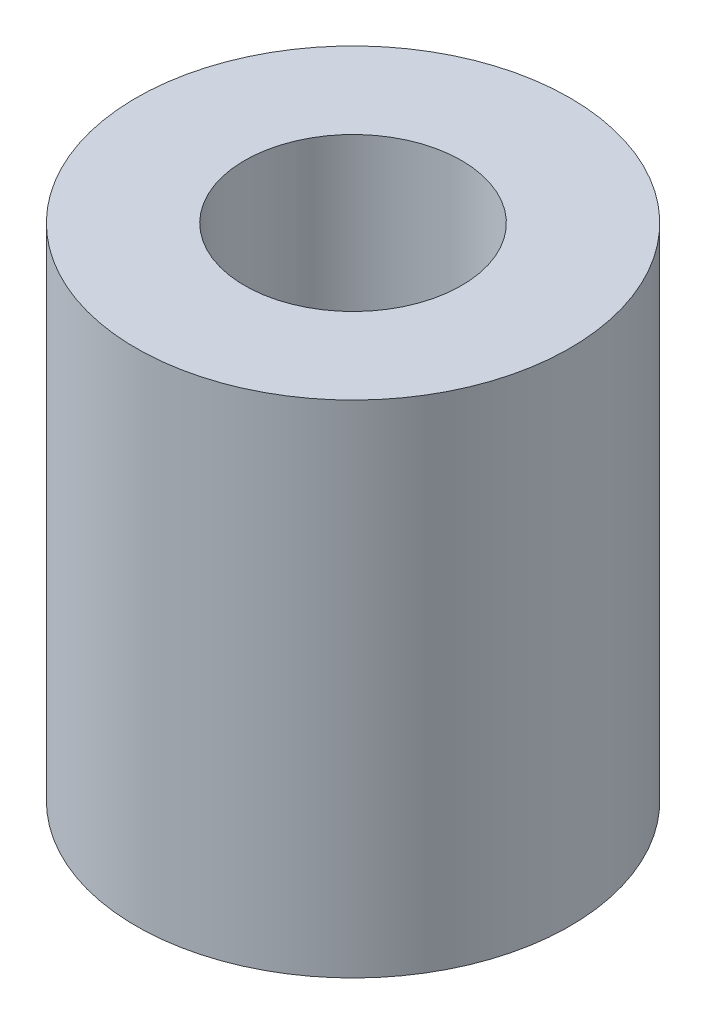
ISO-10303-21;
HEADER;
FILE_DESCRIPTION(('STEP AP214'),'2;1');
FILE_NAME('part.step','',(''),(''),'','','');
FILE_SCHEMA(('AUTOMOTIVE_DESIGN { 1 0 10303 214 1 1 1 1 }'));
ENDSEC;
DATA;
#1=APPLICATION_CONTEXT('core data for automotive mechanical design processes');
#2=APPLICATION_PROTOCOL_DEFINITION('international standard','automotive_design',2000,#1);
#3=PRODUCT_CONTEXT('',#1,'mechanical');
#4=PRODUCT('Part','Part','',(#3));
#5=PRODUCT_RELATED_PRODUCT_CATEGORY('part','',(#4));
#6=PRODUCT_DEFINITION_FORMATION('','',#4);
#7=PRODUCT_DEFINITION_CONTEXT('part definition',#1,'design');
#8=PRODUCT_DEFINITION('design','',#6,#7);
#9=PRODUCT_DEFINITION_SHAPE('','',#8);
#10=(LENGTH_UNIT() NAMED_UNIT(*) SI_UNIT(.MILLI.,.METRE.));
#11=(NAMED_UNIT(*) PLANE_ANGLE_UNIT() SI_UNIT($,.RADIAN.));
#12=(NAMED_UNIT(*) SI_UNIT($,.STERADIAN.) SOLID_ANGLE_UNIT());
#13=UNCERTAINTY_MEASURE_WITH_UNIT(LENGTH_MEASURE(1.E-05),#10,'distance_accuracy_value','');
#14=(GEOMETRIC_REPRESENTATION_CONTEXT(3) GLOBAL_UNCERTAINTY_ASSIGNED_CONTEXT((#13)) GLOBAL_UNIT_ASSIGNED_CONTEXT((#10,
#11,#12)) REPRESENTATION_CONTEXT('',''));
#15=CARTESIAN_POINT('',(0.,0.,0.));
#16=DIRECTION('',(0.,0.,1.));
#17=DIRECTION('',(1.,0.,0.));
#18=AXIS2_PLACEMENT_3D('',#15,#16,#17);
#19=CARTESIAN_POINT('',(0.,15.24,0.));
#20=DIRECTION('',(0.,1.,0.));
#21=DIRECTION('',(0.,0.,1.));
#22=AXIS2_PLACEMENT_3D('',#19,#20,#21);
#23=PLANE('',#22);
#24=CARTESIAN_POINT('',(0.,15.24,0.));
#25=DIRECTION('',(0.,1.,0.));
#26=DIRECTION('',(0.,0.,1.));
#27=AXIS2_PLACEMENT_3D('',#24,#25,#26);
#28=CIRCLE('',#27,6.604);
#29=CARTESIAN_POINT('',(0.,15.24,-6.604));
#30=VERTEX_POINT('',#29);
#31=EDGE_CURVE('E10',#30,#30,#28,.T.);
#32=ORIENTED_EDGE('',*,*,#31,.T.);
#33=EDGE_LOOP('',(#32));
#34=FACE_BOUND('',#33,.T.);
#35=CARTESIAN_POINT('',(0.,15.24,0.));
#36=DIRECTION('',(0.,1.,0.));
#37=DIRECTION('',(0.,0.,1.));
#38=AXIS2_PLACEMENT_3D('',#35,#36,#37);
#39=CIRCLE('',#38,3.302);
#40=CARTESIAN_POINT('',(0.,15.24,-3.302));
#41=VERTEX_POINT('',#40);
#42=EDGE_CURVE('E42',#41,#41,#39,.T.);
#43=ORIENTED_EDGE('',*,*,#42,.F.);
#44=EDGE_LOOP('',(#43));
#45=FACE_BOUND('',#44,.T.);
#46=ADVANCED_FACE('F31',(#34,#45),#23,.T.);
#47=CARTESIAN_POINT('',(0.,0.,0.));
#48=DIRECTION('',(0.,1.,0.));
#49=DIRECTION('',(0.,0.,1.));
#50=AXIS2_PLACEMENT_3D('',#47,#48,#49);
#51=PLANE('',#50);
#52=CARTESIAN_POINT('',(0.,0.,0.));
#53=DIRECTION('',(0.,1.,0.));
#54=DIRECTION('',(0.,0.,1.));
#55=AXIS2_PLACEMENT_3D('',#52,#53,#54);
#56=CIRCLE('',#55,6.604);
#57=CARTESIAN_POINT('',(0.,0.,-6.604));
#58=VERTEX_POINT('',#57);
#59=EDGE_CURVE('E35',#58,#58,#56,.T.);
#60=ORIENTED_EDGE('',*,*,#59,.F.);
#61=EDGE_LOOP('',(#60));
#62=FACE_BOUND('',#61,.T.);
#63=CARTESIAN_POINT('',(0.,0.,0.));
#64=DIRECTION('',(0.,1.,0.));
#65=DIRECTION('',(0.,0.,1.));
#66=AXIS2_PLACEMENT_3D('',#63,#64,#65);
#67=CIRCLE('',#66,3.302);
#68=CARTESIAN_POINT('',(0.,0.,-3.302));
#69=VERTEX_POINT('',#68);
#70=EDGE_CURVE('E44',#69,#69,#67,.T.);
#71=ORIENTED_EDGE('',*,*,#70,.T.);
#72=EDGE_LOOP('',(#71));
#73=FACE_BOUND('',#72,.T.);
#74=ADVANCED_FACE('F54',(#62,#73),#51,.F.);
#75=CARTESIAN_POINT('',(0.,15.24,0.));
#76=DIRECTION('',(0.,-1.,0.));
#77=DIRECTION('',(0.,0.,-1.));
#78=AXIS2_PLACEMENT_3D('',#75,#76,#77);
#79=CYLINDRICAL_SURFACE('',#78,6.604);
#80=CARTESIAN_POINT('',(0.,15.24,-6.604));
#81=CARTESIAN_POINT('',(0.,15.08125,-6.604));
#82=CARTESIAN_POINT('',(0.,14.9225,-6.604));
#83=CARTESIAN_POINT('',(0.,14.605,-6.604));
#84=CARTESIAN_POINT('',(0.,14.44625,-6.604));
#85=CARTESIAN_POINT('',(0.,14.12875,-6.604));
#86=CARTESIAN_POINT('',(0.,13.97,-6.604));
#87=CARTESIAN_POINT('',(0.,13.6525,-6.604));
#88=CARTESIAN_POINT('',(0.,13.49375,-6.604));
#89=CARTESIAN_POINT('',(0.,13.17625,-6.604));
#90=CARTESIAN_POINT('',(0.,13.0175,-6.604));
#91=CARTESIAN_POINT('',(0.,12.7,-6.604));
#92=CARTESIAN_POINT('',(0.,12.54125,-6.604));
#93=CARTESIAN_POINT('',(0.,12.22375,-6.604));
#94=CARTESIAN_POINT('',(0.,12.065,-6.604));
#95=CARTESIAN_POINT('',(0.,11.7475,-6.604));
#96=CARTESIAN_POINT('',(0.,11.58875,-6.604));
#97=CARTESIAN_POINT('',(0.,11.27125,-6.604));
#98=CARTESIAN_POINT('',(0.,11.1125,-6.604));
#99=CARTESIAN_POINT('',(0.,10.795,-6.604));
#100=CARTESIAN_POINT('',(0.,10.63625,-6.604));
#101=CARTESIAN_POINT('',(0.,10.31875,-6.604));
#102=CARTESIAN_POINT('',(0.,10.16,-6.604));
#103=CARTESIAN_POINT('',(0.,9.8425,-6.604));
#104=CARTESIAN_POINT('',(0.,9.68375,-6.604));
#105=CARTESIAN_POINT('',(0.,9.36625,-6.604));
#106=CARTESIAN_POINT('',(0.,9.2075,-6.604));
#107=CARTESIAN_POINT('',(0.,8.89,-6.604));
#108=CARTESIAN_POINT('',(0.,8.73125,-6.604));
#109=CARTESIAN_POINT('',(0.,8.41375,-6.604));
#110=CARTESIAN_POINT('',(0.,8.255,-6.604));
#111=CARTESIAN_POINT('',(0.,7.9375,-6.604));
#112=CARTESIAN_POINT('',(0.,7.77875,-6.604));
#113=CARTESIAN_POINT('',(0.,7.46125,-6.604));
#114=CARTESIAN_POINT('',(0.,7.3025,-6.604));
#115=CARTESIAN_POINT('',(0.,6.985,-6.604));
#116=CARTESIAN_POINT('',(0.,6.82625,-6.604));
#117=CARTESIAN_POINT('',(0.,6.50875,-6.604));
#118=CARTESIAN_POINT('',(0.,6.35,-6.604));
#119=CARTESIAN_POINT('',(0.,6.0325,-6.604));
#120=CARTESIAN_POINT('',(0.,5.87375,-6.604));
#121=CARTESIAN_POINT('',(0.,5.55625,-6.604));
#122=CARTESIAN_POINT('',(0.,5.3975,-6.604));
#123=CARTESIAN_POINT('',(0.,5.08,-6.604));
#124=CARTESIAN_POINT('',(0.,4.92125,-6.604));
#125=CARTESIAN_POINT('',(0.,4.60375,-6.604));
#126=CARTESIAN_POINT('',(0.,4.445,-6.604));
#127=CARTESIAN_POINT('',(0.,4.1275,-6.604));
#128=CARTESIAN_POINT('',(0.,3.96875,-6.604));
#129=CARTESIAN_POINT('',(0.,3.65125,-6.604));
#130=CARTESIAN_POINT('',(0.,3.4925,-6.604));
#131=CARTESIAN_POINT('',(0.,3.175,-6.604));
#132=CARTESIAN_POINT('',(0.,3.01625,-6.604));
#133=CARTESIAN_POINT('',(0.,2.69875,-6.604));
#134=CARTESIAN_POINT('',(0.,2.54,-6.604));
#135=CARTESIAN_POINT('',(0.,2.2225,-6.604));
#136=CARTESIAN_POINT('',(0.,2.06375,-6.604));
#137=CARTESIAN_POINT('',(0.,1.74625,-6.604));
#138=CARTESIAN_POINT('',(0.,1.5875,-6.604));
#139=CARTESIAN_POINT('',(0.,1.27,-6.604));
#140=CARTESIAN_POINT('',(0.,1.11125,-6.604));
#141=CARTESIAN_POINT('',(0.,0.79375,-6.604));
#142=CARTESIAN_POINT('',(0.,0.634999999999999,-6.604));
#143=CARTESIAN_POINT('',(0.,0.3175,-6.604));
#144=CARTESIAN_POINT('',(0.,0.15875,-6.604));
#145=CARTESIAN_POINT('',(0.,0.,-6.604));
#146=B_SPLINE_CURVE_WITH_KNOTS('',3,(#80,#81,#82,#83,#84,#85,#86,#87,#88,#89,#90,#91,#92,#93,
#94,#95,#96,#97,#98,#99,#100,#101,#102,#103,#104,#105,#106,#107,#108,#109,#110,#111,#112,#113,
#114,#115,#116,#117,#118,#119,#120,#121,#122,#123,#124,#125,#126,#127,#128,#129,#130,#131,#132,
#133,#134,#135,#136,#137,#138,#139,#140,#141,#142,#143,#144,#145),.UNSPECIFIED.,.F.,.F.,(4,2,2,
2,2,2,2,2,2,2,2,2,2,2,2,2,2,2,2,2,2,2,2,2,2,2,2,2,2,2,2,2,4),(0.,0.476249999999999,
0.952499999999998,1.42875,1.905,2.38125,2.8575,3.33375,3.81,4.28625,4.7625,5.23875,5.715,
6.19125,6.6675,7.14375,7.62,8.09625,8.5725,9.04875,9.525,10.00125,10.4775,10.95375,11.43,
11.90625,12.3825,12.85875,13.335,13.81125,14.2875,14.76375,15.24),.UNSPECIFIED.);
#147=EDGE_CURVE('BSEAM33',#30,#58,#146,.T.);
#148=ORIENTED_EDGE('',*,*,#31,.F.);
#149=ORIENTED_EDGE('',*,*,#59,.T.);
#150=ORIENTED_EDGE('',*,*,#147,.T.);
#151=ORIENTED_EDGE('',*,*,#147,.F.);
#152=EDGE_LOOP('',(#148,#150,#149,#151));
#153=FACE_BOUND('',#152,.T.);
#154=ADVANCED_FACE('F33',(#153),#79,.T.);
#155=CARTESIAN_POINT('',(0.,15.24,0.));
#156=DIRECTION('',(0.,-1.,0.));
#157=DIRECTION('',(0.,0.,-1.));
#158=AXIS2_PLACEMENT_3D('',#155,#156,#157);
#159=CYLINDRICAL_SURFACE('',#158,3.302);
#160=CARTESIAN_POINT('',(0.,15.24,-3.302));
#161=CARTESIAN_POINT('',(0.,15.08125,-3.302));
#162=CARTESIAN_POINT('',(0.,14.9225,-3.302));
#163=CARTESIAN_POINT('',(0.,14.605,-3.302));
#164=CARTESIAN_POINT('',(0.,14.44625,-3.302));
#165=CARTESIAN_POINT('',(0.,14.12875,-3.302));
#166=CARTESIAN_POINT('',(0.,13.97,-3.302));
#167=CARTESIAN_POINT('',(0.,13.6525,-3.302));
#168=CARTESIAN_POINT('',(0.,13.49375,-3.302));
#169=CARTESIAN_POINT('',(0.,13.17625,-3.302));
#170=CARTESIAN_POINT('',(0.,13.0175,-3.302));
#171=CARTESIAN_POINT('',(0.,12.7,-3.302));
#172=CARTESIAN_POINT('',(0.,12.54125,-3.302));
#173=CARTESIAN_POINT('',(0.,12.22375,-3.302));
#174=CARTESIAN_POINT('',(0.,12.065,-3.302));
#175=CARTESIAN_POINT('',(0.,11.7475,-3.302));
#176=CARTESIAN_POINT('',(0.,11.58875,-3.302));
#177=CARTESIAN_POINT('',(0.,11.27125,-3.302));
#178=CARTESIAN_POINT('',(0.,11.1125,-3.302));
#179=CARTESIAN_POINT('',(0.,10.795,-3.302));
#180=CARTESIAN_POINT('',(0.,10.63625,-3.302));
#181=CARTESIAN_POINT('',(0.,10.31875,-3.302));
#182=CARTESIAN_POINT('',(0.,10.16,-3.302));
#183=CARTESIAN_POINT('',(0.,9.8425,-3.302));
#184=CARTESIAN_POINT('',(0.,9.68375,-3.302));
#185=CARTESIAN_POINT('',(0.,9.36625,-3.302));
#186=CARTESIAN_POINT('',(0.,9.2075,-3.302));
#187=CARTESIAN_POINT('',(0.,8.89,-3.302));
#188=CARTESIAN_POINT('',(0.,8.73125,-3.302));
#189=CARTESIAN_POINT('',(0.,8.41375,-3.302));
#190=CARTESIAN_POINT('',(0.,8.255,-3.302));
#191=CARTESIAN_POINT('',(0.,7.9375,-3.302));
#192=CARTESIAN_POINT('',(0.,7.77875,-3.302));
#193=CARTESIAN_POINT('',(0.,7.46125,-3.302));
#194=CARTESIAN_POINT('',(0.,7.3025,-3.302));
#195=CARTESIAN_POINT('',(0.,6.985,-3.302));
#196=CARTESIAN_POINT('',(0.,6.82625,-3.302));
#197=CARTESIAN_POINT('',(0.,6.50875,-3.302));
#198=CARTESIAN_POINT('',(0.,6.35,-3.302));
#199=CARTESIAN_POINT('',(0.,6.0325,-3.302));
#200=CARTESIAN_POINT('',(0.,5.87375,-3.302));
#201=CARTESIAN_POINT('',(0.,5.55625,-3.302));
#202=CARTESIAN_POINT('',(0.,5.3975,-3.302));
#203=CARTESIAN_POINT('',(0.,5.08,-3.302));
#204=CARTESIAN_POINT('',(0.,4.92125,-3.302));
#205=CARTESIAN_POINT('',(0.,4.60375,-3.302));
#206=CARTESIAN_POINT('',(0.,4.445,-3.302));
#207=CARTESIAN_POINT('',(0.,4.1275,-3.302));
#208=CARTESIAN_POINT('',(0.,3.96875,-3.302));
#209=CARTESIAN_POINT('',(0.,3.65125,-3.302));
#210=CARTESIAN_POINT('',(0.,3.4925,-3.302));
#211=CARTESIAN_POINT('',(0.,3.175,-3.302));
#212=CARTESIAN_POINT('',(0.,3.01625,-3.302));
#213=CARTESIAN_POINT('',(0.,2.69875,-3.302));
#214=CARTESIAN_POINT('',(0.,2.54,-3.302));
#215=CARTESIAN_POINT('',(0.,2.2225,-3.302));
#216=CARTESIAN_POINT('',(0.,2.06375,-3.302));
#217=CARTESIAN_POINT('',(0.,1.74625,-3.302));
#218=CARTESIAN_POINT('',(0.,1.5875,-3.302));
#219=CARTESIAN_POINT('',(0.,1.27,-3.302));
#220=CARTESIAN_POINT('',(0.,1.11125,-3.302));
#221=CARTESIAN_POINT('',(0.,0.79375,-3.302));
#222=CARTESIAN_POINT('',(0.,0.634999999999999,-3.302));
#223=CARTESIAN_POINT('',(0.,0.3175,-3.302));
#224=CARTESIAN_POINT('',(0.,0.15875,-3.302));
#225=CARTESIAN_POINT('',(0.,0.,-3.302));
#226=B_SPLINE_CURVE_WITH_KNOTS('',3,(#160,#161,#162,#163,#164,#165,#166,#167,#168,#169,#170,
#171,#172,#173,#174,#175,#176,#177,#178,#179,#180,#181,#182,#183,#184,#185,#186,#187,#188,#189,
#190,#191,#192,#193,#194,#195,#196,#197,#198,#199,#200,#201,#202,#203,#204,#205,#206,#207,#208,
#209,#210,#211,#212,#213,#214,#215,#216,#217,#218,#219,#220,#221,#222,#223,#224,#225),
.UNSPECIFIED.,.F.,.F.,(4,2,2,2,2,2,2,2,2,2,2,2,2,2,2,2,2,2,2,2,2,2,2,2,2,2,2,2,2,2,2,2,4),(0.,
0.476249999999999,0.952499999999998,1.42875,1.905,2.38125,2.8575,3.33375,3.81,4.28625,4.7625,
5.23875,5.715,6.19125,6.6675,7.14375,7.62,8.09625,8.5725,9.04875,9.525,10.00125,10.4775,
10.95375,11.43,11.90625,12.3825,12.85875,13.335,13.81125,14.2875,14.76375,15.24),.UNSPECIFIED.);
#227=EDGE_CURVE('BSEAM50',#41,#69,#226,.T.);
#228=ORIENTED_EDGE('',*,*,#42,.T.);
#229=ORIENTED_EDGE('',*,*,#70,.F.);
#230=ORIENTED_EDGE('',*,*,#227,.T.);
#231=ORIENTED_EDGE('',*,*,#227,.F.);
#232=EDGE_LOOP('',(#228,#230,#229,#231));
#233=FACE_BOUND('',#232,.T.);
#234=ADVANCED_FACE('F50',(#233),#159,.F.);
#235=CLOSED_SHELL('',(#46,#74,#154,#234));
#236=MANIFOLD_SOLID_BREP('B2',#235);
#237=ADVANCED_BREP_SHAPE_REPRESENTATION('',(#18,#236),#14);
#238=SHAPE_DEFINITION_REPRESENTATION(#9,#237);
ENDSEC;
END-ISO-10303-21;
